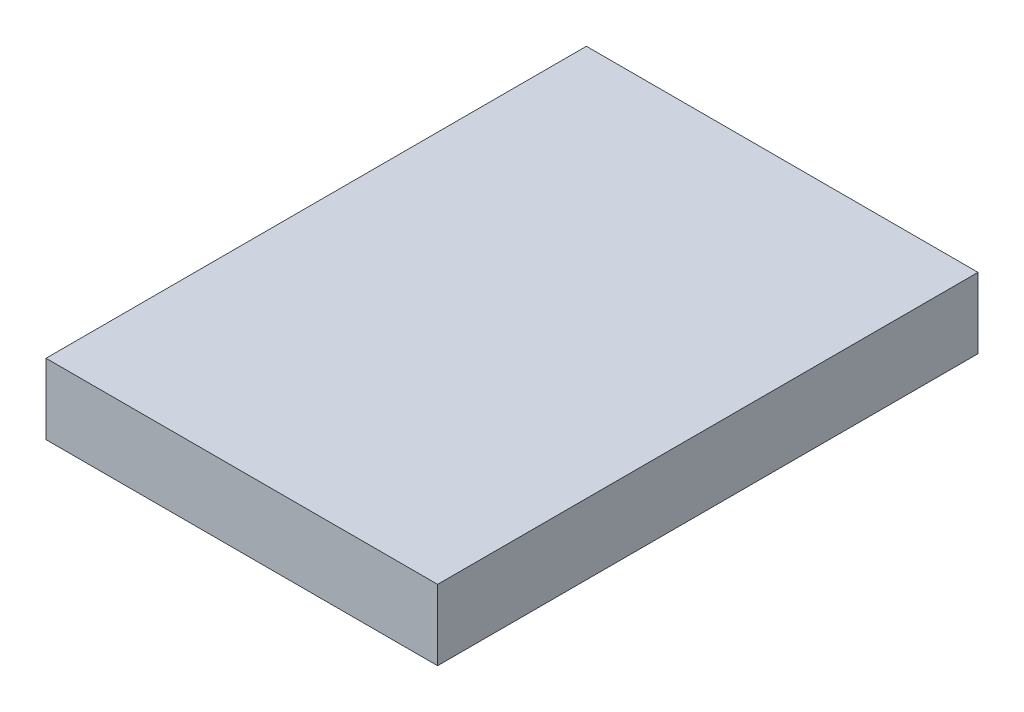
ISO-10303-21;
HEADER;
FILE_DESCRIPTION(('STEP AP214'),'2;1');
FILE_NAME('part.step','',(''),(''),'','','');
FILE_SCHEMA(('AUTOMOTIVE_DESIGN { 1 0 10303 214 1 1 1 1 }'));
ENDSEC;
DATA;
#1=APPLICATION_CONTEXT('core data for automotive mechanical design processes');
#2=APPLICATION_PROTOCOL_DEFINITION('international standard','automotive_design',2000,#1);
#3=PRODUCT_CONTEXT('',#1,'mechanical');
#4=PRODUCT('Part','Part','',(#3));
#5=PRODUCT_RELATED_PRODUCT_CATEGORY('part','',(#4));
#6=PRODUCT_DEFINITION_FORMATION('','',#4);
#7=PRODUCT_DEFINITION_CONTEXT('part definition',#1,'design');
#8=PRODUCT_DEFINITION('design','',#6,#7);
#9=PRODUCT_DEFINITION_SHAPE('','',#8);
#10=(LENGTH_UNIT() NAMED_UNIT(*) SI_UNIT(.MILLI.,.METRE.));
#11=(NAMED_UNIT(*) PLANE_ANGLE_UNIT() SI_UNIT($,.RADIAN.));
#12=(NAMED_UNIT(*) SI_UNIT($,.STERADIAN.) SOLID_ANGLE_UNIT());
#13=UNCERTAINTY_MEASURE_WITH_UNIT(LENGTH_MEASURE(1.E-05),#10,'distance_accuracy_value','');
#14=(GEOMETRIC_REPRESENTATION_CONTEXT(3) GLOBAL_UNCERTAINTY_ASSIGNED_CONTEXT((#13)) GLOBAL_UNIT_ASSIGNED_CONTEXT((#10,
#11,#12)) REPRESENTATION_CONTEXT('',''));
#15=CARTESIAN_POINT('',(0.,0.,0.));
#16=DIRECTION('',(0.,0.,1.));
#17=DIRECTION('',(1.,0.,0.));
#18=AXIS2_PLACEMENT_3D('',#15,#16,#17);
#19=CARTESIAN_POINT('',(12.5,4.5,17.25));
#20=DIRECTION('',(-1.,0.,0.));
#21=DIRECTION('',(0.,0.,1.));
#22=AXIS2_PLACEMENT_3D('',#19,#20,#21);
#23=PLANE('',#22);
#24=DIRECTION('',(0.,0.,-1.));
#25=VECTOR('',#24,1.);
#26=CARTESIAN_POINT('',(12.5,0.,17.25));
#27=LINE('',#26,#25);
#28=CARTESIAN_POINT('',(12.5,0.,17.25));
#29=VERTEX_POINT('',#28);
#30=CARTESIAN_POINT('',(12.5,0.,-17.25));
#31=VERTEX_POINT('',#30);
#32=EDGE_CURVE('E110',#29,#31,#27,.T.);
#33=ORIENTED_EDGE('',*,*,#32,.T.);
#34=DIRECTION('',(0.,-1.,0.));
#35=VECTOR('',#34,1.);
#36=CARTESIAN_POINT('',(12.5,4.5,-17.25));
#37=LINE('',#36,#35);
#38=CARTESIAN_POINT('',(12.5,4.5,-17.25));
#39=VERTEX_POINT('',#38);
#40=EDGE_CURVE('E11',#39,#31,#37,.T.);
#41=ORIENTED_EDGE('',*,*,#40,.F.);
#42=DIRECTION('',(0.,0.,-1.));
#43=VECTOR('',#42,1.);
#44=CARTESIAN_POINT('',(12.5,4.5,17.25));
#45=LINE('',#44,#43);
#46=CARTESIAN_POINT('',(12.5,4.5,17.25));
#47=VERTEX_POINT('',#46);
#48=EDGE_CURVE('E94',#47,#39,#45,.T.);
#49=ORIENTED_EDGE('',*,*,#48,.F.);
#50=DIRECTION('',(0.,-1.,0.));
#51=VECTOR('',#50,1.);
#52=CARTESIAN_POINT('',(12.5,4.5,17.25));
#53=LINE('',#52,#51);
#54=EDGE_CURVE('E106',#47,#29,#53,.T.);
#55=ORIENTED_EDGE('',*,*,#54,.T.);
#56=EDGE_LOOP('',(#33,#41,#49,#55));
#57=FACE_BOUND('',#56,.T.);
#58=ADVANCED_FACE('F42',(#57),#23,.F.);
#59=CARTESIAN_POINT('',(-12.5,4.5,-17.25));
#60=DIRECTION('',(0.,0.,1.));
#61=DIRECTION('',(1.,0.,0.));
#62=AXIS2_PLACEMENT_3D('',#59,#60,#61);
#63=PLANE('',#62);
#64=DIRECTION('',(-1.,0.,0.));
#65=VECTOR('',#64,1.);
#66=CARTESIAN_POINT('',(-12.5,0.,-17.25));
#67=LINE('',#66,#65);
#68=CARTESIAN_POINT('',(-12.5,0.,-17.25));
#69=VERTEX_POINT('',#68);
#70=EDGE_CURVE('E99',#31,#69,#67,.T.);
#71=ORIENTED_EDGE('',*,*,#70,.T.);
#72=DIRECTION('',(0.,-1.,0.));
#73=VECTOR('',#72,1.);
#74=CARTESIAN_POINT('',(-12.5,4.5,-17.25));
#75=LINE('',#74,#73);
#76=CARTESIAN_POINT('',(-12.5,4.5,-17.25));
#77=VERTEX_POINT('',#76);
#78=EDGE_CURVE('E51',#77,#69,#75,.T.);
#79=ORIENTED_EDGE('',*,*,#78,.F.);
#80=DIRECTION('',(-1.,0.,0.));
#81=VECTOR('',#80,1.);
#82=CARTESIAN_POINT('',(-12.5,4.5,-17.25));
#83=LINE('',#82,#81);
#84=EDGE_CURVE('E89',#39,#77,#83,.T.);
#85=ORIENTED_EDGE('',*,*,#84,.F.);
#86=ORIENTED_EDGE('',*,*,#40,.T.);
#87=EDGE_LOOP('',(#71,#79,#85,#86));
#88=FACE_BOUND('',#87,.T.);
#89=ADVANCED_FACE('F98',(#88),#63,.F.);
#90=CARTESIAN_POINT('',(-12.5,4.5,17.25));
#91=DIRECTION('',(1.,0.,0.));
#92=DIRECTION('',(0.,0.,-1.));
#93=AXIS2_PLACEMENT_3D('',#90,#91,#92);
#94=PLANE('',#93);
#95=DIRECTION('',(0.,0.,1.));
#96=VECTOR('',#95,1.);
#97=CARTESIAN_POINT('',(-12.5,0.,17.25));
#98=LINE('',#97,#96);
#99=CARTESIAN_POINT('',(-12.5,0.,17.25));
#100=VERTEX_POINT('',#99);
#101=EDGE_CURVE('E76',#69,#100,#98,.T.);
#102=ORIENTED_EDGE('',*,*,#101,.T.);
#103=DIRECTION('',(0.,-1.,0.));
#104=VECTOR('',#103,1.);
#105=CARTESIAN_POINT('',(-12.5,4.5,17.25));
#106=LINE('',#105,#104);
#107=CARTESIAN_POINT('',(-12.5,4.5,17.25));
#108=VERTEX_POINT('',#107);
#109=EDGE_CURVE('E101',#108,#100,#106,.T.);
#110=ORIENTED_EDGE('',*,*,#109,.F.);
#111=DIRECTION('',(0.,0.,1.));
#112=VECTOR('',#111,1.);
#113=CARTESIAN_POINT('',(-12.5,4.5,17.25));
#114=LINE('',#113,#112);
#115=EDGE_CURVE('E92',#77,#108,#114,.T.);
#116=ORIENTED_EDGE('',*,*,#115,.F.);
#117=ORIENTED_EDGE('',*,*,#78,.T.);
#118=EDGE_LOOP('',(#102,#110,#116,#117));
#119=FACE_BOUND('',#118,.T.);
#120=ADVANCED_FACE('F102',(#119),#94,.F.);
#121=CARTESIAN_POINT('',(-12.5,4.5,17.25));
#122=DIRECTION('',(0.,0.,-1.));
#123=DIRECTION('',(-1.,0.,0.));
#124=AXIS2_PLACEMENT_3D('',#121,#122,#123);
#125=PLANE('',#124);
#126=DIRECTION('',(1.,0.,0.));
#127=VECTOR('',#126,1.);
#128=CARTESIAN_POINT('',(-12.5,0.,17.25));
#129=LINE('',#128,#127);
#130=EDGE_CURVE('E82',#100,#29,#129,.T.);
#131=ORIENTED_EDGE('',*,*,#130,.T.);
#132=ORIENTED_EDGE('',*,*,#54,.F.);
#133=DIRECTION('',(1.,0.,0.));
#134=VECTOR('',#133,1.);
#135=CARTESIAN_POINT('',(-12.5,4.5,17.25));
#136=LINE('',#135,#134);
#137=EDGE_CURVE('E59',#108,#47,#136,.T.);
#138=ORIENTED_EDGE('',*,*,#137,.F.);
#139=ORIENTED_EDGE('',*,*,#109,.T.);
#140=EDGE_LOOP('',(#131,#132,#138,#139));
#141=FACE_BOUND('',#140,.T.);
#142=ADVANCED_FACE('F123',(#141),#125,.F.);
#143=CARTESIAN_POINT('',(0.,4.5,0.));
#144=DIRECTION('',(0.,-1.,0.));
#145=DIRECTION('',(0.,0.,-1.));
#146=AXIS2_PLACEMENT_3D('',#143,#144,#145);
#147=PLANE('',#146);
#148=ORIENTED_EDGE('',*,*,#48,.T.);
#149=ORIENTED_EDGE('',*,*,#84,.T.);
#150=ORIENTED_EDGE('',*,*,#115,.T.);
#151=ORIENTED_EDGE('',*,*,#137,.T.);
#152=EDGE_LOOP('',(#148,#149,#150,#151));
#153=FACE_BOUND('',#152,.T.);
#154=ADVANCED_FACE('F90',(#153),#147,.F.);
#155=CARTESIAN_POINT('',(0.,0.,0.));
#156=DIRECTION('',(0.,-1.,0.));
#157=DIRECTION('',(0.,0.,-1.));
#158=AXIS2_PLACEMENT_3D('',#155,#156,#157);
#159=PLANE('',#158);
#160=ORIENTED_EDGE('',*,*,#32,.F.);
#161=ORIENTED_EDGE('',*,*,#130,.F.);
#162=ORIENTED_EDGE('',*,*,#101,.F.);
#163=ORIENTED_EDGE('',*,*,#70,.F.);
#164=EDGE_LOOP('',(#160,#161,#162,#163));
#165=FACE_BOUND('',#164,.T.);
#166=ADVANCED_FACE('F126',(#165),#159,.T.);
#167=CLOSED_SHELL('',(#58,#89,#120,#142,#154,#166));
#168=MANIFOLD_SOLID_BREP('B2',#167);
#169=ADVANCED_BREP_SHAPE_REPRESENTATION('',(#18,#168),#14);
#170=SHAPE_DEFINITION_REPRESENTATION(#9,#169);
ENDSEC;
END-ISO-10303-21;
